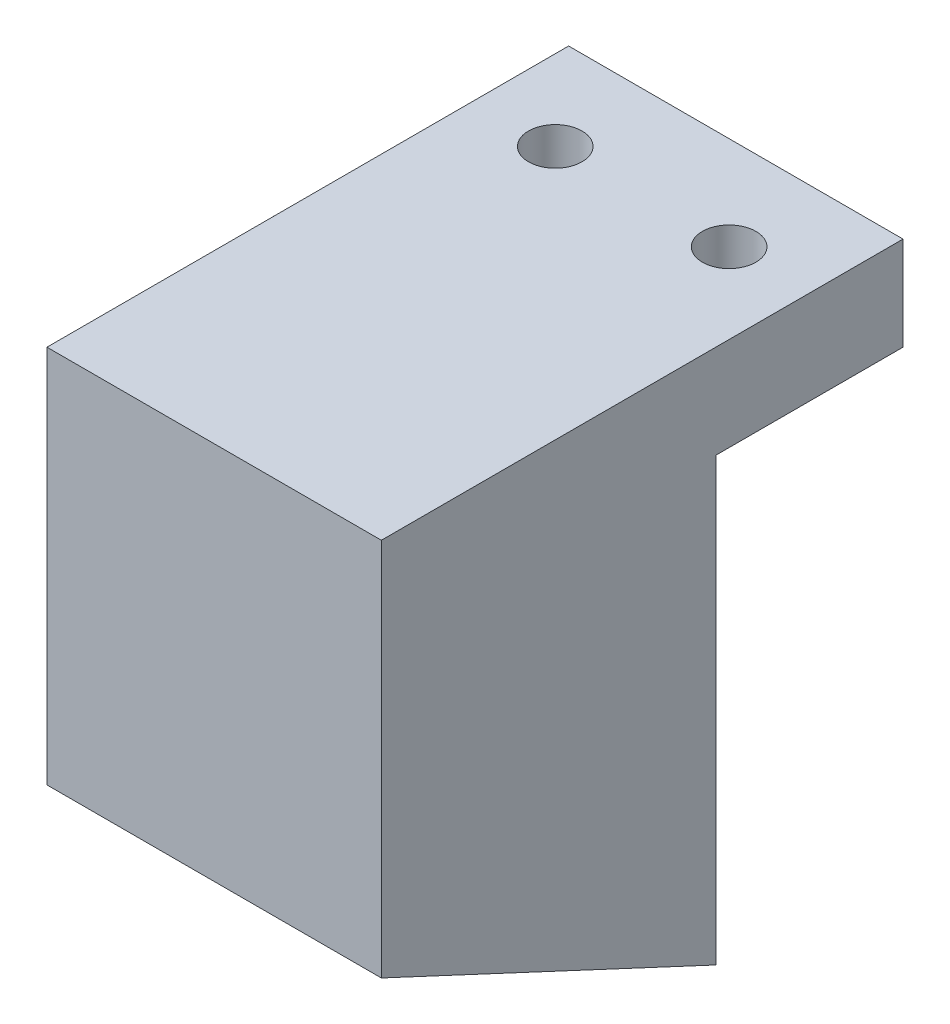
ISO-10303-21;
HEADER;
FILE_DESCRIPTION(('STEP AP214'),'2;1');
FILE_NAME('part.step','',(''),(''),'','','');
FILE_SCHEMA(('AUTOMOTIVE_DESIGN { 1 0 10303 214 1 1 1 1 }'));
ENDSEC;
DATA;
#1=APPLICATION_CONTEXT('core data for automotive mechanical design processes');
#2=APPLICATION_PROTOCOL_DEFINITION('international standard','automotive_design',2000,#1);
#3=PRODUCT_CONTEXT('',#1,'mechanical');
#4=PRODUCT('Part','Part','',(#3));
#5=PRODUCT_RELATED_PRODUCT_CATEGORY('part','',(#4));
#6=PRODUCT_DEFINITION_FORMATION('','',#4);
#7=PRODUCT_DEFINITION_CONTEXT('part definition',#1,'design');
#8=PRODUCT_DEFINITION('design','',#6,#7);
#9=PRODUCT_DEFINITION_SHAPE('','',#8);
#10=(LENGTH_UNIT() NAMED_UNIT(*) SI_UNIT(.MILLI.,.METRE.));
#11=(NAMED_UNIT(*) PLANE_ANGLE_UNIT() SI_UNIT($,.RADIAN.));
#12=(NAMED_UNIT(*) SI_UNIT($,.STERADIAN.) SOLID_ANGLE_UNIT());
#13=UNCERTAINTY_MEASURE_WITH_UNIT(LENGTH_MEASURE(1.E-05),#10,'distance_accuracy_value','');
#14=(GEOMETRIC_REPRESENTATION_CONTEXT(3) GLOBAL_UNCERTAINTY_ASSIGNED_CONTEXT((#13)) GLOBAL_UNIT_ASSIGNED_CONTEXT((#10,
#11,#12)) REPRESENTATION_CONTEXT('',''));
#15=CARTESIAN_POINT('',(0.,0.,0.));
#16=DIRECTION('',(0.,0.,1.));
#17=DIRECTION('',(1.,0.,0.));
#18=AXIS2_PLACEMENT_3D('',#15,#16,#17);
#19=CARTESIAN_POINT('',(-76.9047619047619,40.,-16.0714285714286));
#20=DIRECTION('',(0.,0.,1.));
#21=DIRECTION('',(1.,0.,0.));
#22=AXIS2_PLACEMENT_3D('',#19,#20,#21);
#23=PLANE('',#22);
#24=DIRECTION('',(-1.,0.,0.));
#25=VECTOR('',#24,1.);
#26=CARTESIAN_POINT('',(-76.9047619047619,33.,-16.0714285714286));
#27=LINE('',#26,#25);
#28=CARTESIAN_POINT('',(-51.9047619047619,33.,-16.0714285714286));
#29=VERTEX_POINT('',#28);
#30=CARTESIAN_POINT('',(-62.9124784932489,33.,-16.0714285714286));
#31=VERTEX_POINT('',#30);
#32=EDGE_CURVE('E43',#29,#31,#27,.T.);
#33=ORIENTED_EDGE('',*,*,#32,.F.);
#34=DIRECTION('',(0.,-1.,0.));
#35=VECTOR('',#34,1.);
#36=CARTESIAN_POINT('',(-51.9047619047619,40.,-16.0714285714286));
#37=LINE('',#36,#35);
#38=CARTESIAN_POINT('',(-51.9047619047619,0.,-16.0714285714286));
#39=VERTEX_POINT('',#38);
#40=EDGE_CURVE('E148',#29,#39,#37,.T.);
#41=ORIENTED_EDGE('',*,*,#40,.T.);
#42=DIRECTION('',(-1.,0.,0.));
#43=VECTOR('',#42,1.);
#44=CARTESIAN_POINT('',(-76.9047619047619,0.,-16.0714285714286));
#45=LINE('',#44,#43);
#46=CARTESIAN_POINT('',(-76.9047619047619,0.,-16.0714285714286));
#47=VERTEX_POINT('',#46);
#48=EDGE_CURVE('E101',#39,#47,#45,.T.);
#49=ORIENTED_EDGE('',*,*,#48,.T.);
#50=DIRECTION('',(0.,-1.,0.));
#51=VECTOR('',#50,1.);
#52=CARTESIAN_POINT('',(-76.9047619047619,40.,-16.0714285714286));
#53=LINE('',#52,#51);
#54=CARTESIAN_POINT('',(-76.9047619047619,33.,-16.0714285714286));
#55=VERTEX_POINT('',#54);
#56=EDGE_CURVE('E144',#55,#47,#53,.T.);
#57=ORIENTED_EDGE('',*,*,#56,.F.);
#58=CARTESIAN_POINT('',(-65.8970453162749,33.,-16.0714285714286));
#59=VERTEX_POINT('',#58);
#60=EDGE_CURVE('E11',#59,#55,#27,.T.);
#61=ORIENTED_EDGE('',*,*,#60,.F.);
#62=CARTESIAN_POINT('',(-64.4047619047619,32.6404446349412,-16.0714285714286));
#63=DIRECTION('',(0.,0.,1.));
#64=DIRECTION('',(0.,-1.,0.));
#65=AXIS2_PLACEMENT_3D('',#62,#63,#64);
#66=ELLIPSE('',#65,3.54930237472879,1.5);
#67=EDGE_CURVE('E131',#59,#31,#66,.T.);
#68=ORIENTED_EDGE('',*,*,#67,.T.);
#69=EDGE_LOOP('',(#33,#41,#49,#57,#61,#68));
#70=FACE_BOUND('',#69,.T.);
#71=ADVANCED_FACE('F33',(#70),#23,.F.);
#72=CARTESIAN_POINT('',(-76.9047619047619,40.,-16.0714285714286));
#73=DIRECTION('',(1.,0.,0.));
#74=DIRECTION('',(0.,0.,-1.));
#75=AXIS2_PLACEMENT_3D('',#72,#73,#74);
#76=PLANE('',#75);
#77=DIRECTION('',(0.,0.,1.));
#78=VECTOR('',#77,1.);
#79=CARTESIAN_POINT('',(-76.9047619047619,40.,-16.0714285714286));
#80=LINE('',#79,#78);
#81=CARTESIAN_POINT('',(-76.9047619047619,40.,-30.0714285714286));
#82=VERTEX_POINT('',#81);
#83=CARTESIAN_POINT('',(-76.9047619047619,40.,8.92857142857143));
#84=VERTEX_POINT('',#83);
#85=EDGE_CURVE('E92',#82,#84,#80,.T.);
#86=ORIENTED_EDGE('',*,*,#85,.F.);
#87=DIRECTION('',(0.,1.,0.));
#88=VECTOR('',#87,1.);
#89=CARTESIAN_POINT('',(-76.9047619047619,40.,-30.0714285714286));
#90=LINE('',#89,#88);
#91=CARTESIAN_POINT('',(-76.9047619047619,33.,-30.0714285714286));
#92=VERTEX_POINT('',#91);
#93=EDGE_CURVE('E96',#92,#82,#90,.T.);
#94=ORIENTED_EDGE('',*,*,#93,.F.);
#95=DIRECTION('',(0.,0.,1.));
#96=VECTOR('',#95,1.);
#97=CARTESIAN_POINT('',(-76.9047619047619,33.,-30.0714285714286));
#98=LINE('',#97,#96);
#99=EDGE_CURVE('E122',#92,#55,#98,.T.);
#100=ORIENTED_EDGE('',*,*,#99,.T.);
#101=ORIENTED_EDGE('',*,*,#56,.T.);
#102=DIRECTION('',(0.,0.422618261740694,0.906307787036653));
#103=VECTOR('',#102,1.);
#104=CARTESIAN_POINT('',(-76.9047619047619,7.14424780626901,-0.750539709049177));
#105=LINE('',#104,#103);
#106=CARTESIAN_POINT('',(-76.9047619047619,11.6576914538748,8.92857142857143));
#107=VERTEX_POINT('',#106);
#108=EDGE_CURVE('E140',#47,#107,#105,.T.);
#109=ORIENTED_EDGE('',*,*,#108,.T.);
#110=DIRECTION('',(0.,-1.,0.));
#111=VECTOR('',#110,1.);
#112=CARTESIAN_POINT('',(-76.9047619047619,40.,8.92857142857143));
#113=LINE('',#112,#111);
#114=EDGE_CURVE('E37',#84,#107,#113,.T.);
#115=ORIENTED_EDGE('',*,*,#114,.F.);
#116=EDGE_LOOP('',(#86,#94,#100,#101,#109,#115));
#117=FACE_BOUND('',#116,.T.);
#118=ADVANCED_FACE('F35',(#117),#76,.F.);
#119=CARTESIAN_POINT('',(-76.9047619047619,40.,8.92857142857143));
#120=DIRECTION('',(0.,0.,-1.));
#121=DIRECTION('',(-1.,0.,0.));
#122=AXIS2_PLACEMENT_3D('',#119,#120,#121);
#123=PLANE('',#122);
#124=ORIENTED_EDGE('',*,*,#114,.T.);
#125=DIRECTION('',(1.,0.,0.));
#126=VECTOR('',#125,1.);
#127=CARTESIAN_POINT('',(-91.9047619047619,11.6576914538748,8.92857142857143));
#128=LINE('',#127,#126);
#129=CARTESIAN_POINT('',(-51.9047619047619,11.6576914538748,8.92857142857143));
#130=VERTEX_POINT('',#129);
#131=EDGE_CURVE('E137',#107,#130,#128,.T.);
#132=ORIENTED_EDGE('',*,*,#131,.T.);
#133=DIRECTION('',(0.,-1.,0.));
#134=VECTOR('',#133,1.);
#135=CARTESIAN_POINT('',(-51.9047619047619,40.,8.92857142857143));
#136=LINE('',#135,#134);
#137=CARTESIAN_POINT('',(-51.9047619047619,40.,8.92857142857143));
#138=VERTEX_POINT('',#137);
#139=EDGE_CURVE('E149',#138,#130,#136,.T.);
#140=ORIENTED_EDGE('',*,*,#139,.F.);
#141=DIRECTION('',(1.,0.,0.));
#142=VECTOR('',#141,1.);
#143=CARTESIAN_POINT('',(-76.9047619047619,40.,8.92857142857143));
#144=LINE('',#143,#142);
#145=EDGE_CURVE('E100',#84,#138,#144,.T.);
#146=ORIENTED_EDGE('',*,*,#145,.F.);
#147=EDGE_LOOP('',(#124,#132,#140,#146));
#148=FACE_BOUND('',#147,.T.);
#149=ADVANCED_FACE('F155',(#148),#123,.F.);
#150=CARTESIAN_POINT('',(-51.9047619047619,40.,-16.0714285714286));
#151=DIRECTION('',(-1.,0.,0.));
#152=DIRECTION('',(0.,0.,1.));
#153=AXIS2_PLACEMENT_3D('',#150,#151,#152);
#154=PLANE('',#153);
#155=ORIENTED_EDGE('',*,*,#139,.T.);
#156=DIRECTION('',(0.,0.422618261740693,0.906307787036653));
#157=VECTOR('',#156,1.);
#158=CARTESIAN_POINT('',(-51.9047619047619,11.6576914538748,8.92857142857143));
#159=LINE('',#158,#157);
#160=EDGE_CURVE('E135',#39,#130,#159,.T.);
#161=ORIENTED_EDGE('',*,*,#160,.F.);
#162=ORIENTED_EDGE('',*,*,#40,.F.);
#163=DIRECTION('',(0.,0.,1.));
#164=VECTOR('',#163,1.);
#165=CARTESIAN_POINT('',(-51.9047619047619,33.,-30.0714285714286));
#166=LINE('',#165,#164);
#167=CARTESIAN_POINT('',(-51.9047619047619,33.,-30.0714285714286));
#168=VERTEX_POINT('',#167);
#169=EDGE_CURVE('E125',#168,#29,#166,.T.);
#170=ORIENTED_EDGE('',*,*,#169,.F.);
#171=DIRECTION('',(0.,-1.,0.));
#172=VECTOR('',#171,1.);
#173=CARTESIAN_POINT('',(-51.9047619047619,40.,-30.0714285714286));
#174=LINE('',#173,#172);
#175=CARTESIAN_POINT('',(-51.9047619047619,40.,-30.0714285714286));
#176=VERTEX_POINT('',#175);
#177=EDGE_CURVE('E110',#176,#168,#174,.T.);
#178=ORIENTED_EDGE('',*,*,#177,.F.);
#179=DIRECTION('',(0.,0.,-1.));
#180=VECTOR('',#179,1.);
#181=CARTESIAN_POINT('',(-51.9047619047619,40.,-16.0714285714286));
#182=LINE('',#181,#180);
#183=EDGE_CURVE('E107',#138,#176,#182,.T.);
#184=ORIENTED_EDGE('',*,*,#183,.F.);
#185=EDGE_LOOP('',(#155,#161,#162,#170,#178,#184));
#186=FACE_BOUND('',#185,.T.);
#187=ADVANCED_FACE('F156',(#186),#154,.F.);
#188=CARTESIAN_POINT('',(0.,40.,0.));
#189=DIRECTION('',(0.,1.,0.));
#190=DIRECTION('',(0.,0.,1.));
#191=AXIS2_PLACEMENT_3D('',#188,#189,#190);
#192=PLANE('',#191);
#193=CARTESIAN_POINT('',(-70.9047619047619,40.,-23.0714285714286));
#194=DIRECTION('',(0.,1.,0.));
#195=DIRECTION('',(0.,0.,1.));
#196=AXIS2_PLACEMENT_3D('',#193,#194,#195);
#197=CIRCLE('',#196,2.);
#198=CARTESIAN_POINT('',(-70.9047619047619,40.,-21.0714285714286));
#199=VERTEX_POINT('',#198);
#200=EDGE_CURVE('E118',#199,#199,#197,.T.);
#201=ORIENTED_EDGE('',*,*,#200,.F.);
#202=EDGE_LOOP('',(#201));
#203=FACE_BOUND('',#202,.T.);
#204=CARTESIAN_POINT('',(-57.9047619047619,40.,-23.0714285714286));
#205=DIRECTION('',(0.,1.,0.));
#206=DIRECTION('',(0.,0.,1.));
#207=AXIS2_PLACEMENT_3D('',#204,#205,#206);
#208=CIRCLE('',#207,2.);
#209=CARTESIAN_POINT('',(-57.9047619047619,40.,-21.0714285714286));
#210=VERTEX_POINT('',#209);
#211=EDGE_CURVE('E283',#210,#210,#208,.T.);
#212=ORIENTED_EDGE('',*,*,#211,.F.);
#213=EDGE_LOOP('',(#212));
#214=FACE_BOUND('',#213,.T.);
#215=ORIENTED_EDGE('',*,*,#85,.T.);
#216=ORIENTED_EDGE('',*,*,#145,.T.);
#217=ORIENTED_EDGE('',*,*,#183,.T.);
#218=DIRECTION('',(1.,0.,0.));
#219=VECTOR('',#218,1.);
#220=CARTESIAN_POINT('',(-76.9047619047619,40.,-30.0714285714286));
#221=LINE('',#220,#219);
#222=EDGE_CURVE('E104',#82,#176,#221,.T.);
#223=ORIENTED_EDGE('',*,*,#222,.F.);
#224=EDGE_LOOP('',(#215,#216,#217,#223));
#225=FACE_BOUND('',#224,.T.);
#226=ADVANCED_FACE('F105',(#203,#214,#225),#192,.T.);
#227=CARTESIAN_POINT('',(-91.9047619047619,11.6576914538748,8.92857142857143));
#228=DIRECTION('',(0.,0.906307787036653,-0.422618261740693));
#229=DIRECTION('',(0.,0.422618261740694,0.906307787036653));
#230=AXIS2_PLACEMENT_3D('',#227,#228,#229);
#231=PLANE('',#230);
#232=CARTESIAN_POINT('',(-64.4047619047619,5.8297856244706,-3.56941295466401));
#233=DIRECTION('',(0.,-0.906307787036653,0.422618261740693));
#234=DIRECTION('',(0.,-0.422618261740693,-0.906307787036653));
#235=AXIS2_PLACEMENT_3D('',#232,#233,#234);
#236=CIRCLE('',#235,1.5);
#237=CARTESIAN_POINT('',(-64.4047619047619,5.19585823185957,-4.92887463521898));
#238=VERTEX_POINT('',#237);
#239=EDGE_CURVE('E128',#238,#238,#236,.T.);
#240=ORIENTED_EDGE('',*,*,#239,.F.);
#241=EDGE_LOOP('',(#240));
#242=FACE_BOUND('',#241,.T.);
#243=ORIENTED_EDGE('',*,*,#48,.F.);
#244=ORIENTED_EDGE('',*,*,#160,.T.);
#245=ORIENTED_EDGE('',*,*,#131,.F.);
#246=ORIENTED_EDGE('',*,*,#108,.F.);
#247=EDGE_LOOP('',(#243,#244,#245,#246));
#248=FACE_BOUND('',#247,.T.);
#249=ADVANCED_FACE('F164',(#242,#248),#231,.F.);
#250=CARTESIAN_POINT('',(-64.4047619047619,38.4568659577901,-18.783670377329));
#251=DIRECTION('',(0.,-0.906307787036653,0.422618261740693));
#252=DIRECTION('',(0.,-0.422618261740693,-0.906307787036653));
#253=AXIS2_PLACEMENT_3D('',#250,#251,#252);
#254=CYLINDRICAL_SURFACE('',#253,1.5);
#255=ORIENTED_EDGE('',*,*,#239,.T.);
#256=EDGE_LOOP('',(#255));
#257=FACE_BOUND('',#256,.T.);
#258=EDGE_CURVE('E132',#31,#59,#66,.T.);
#259=ORIENTED_EDGE('',*,*,#258,.F.);
#260=ORIENTED_EDGE('',*,*,#67,.F.);
#261=EDGE_LOOP('',(#259,#260));
#262=FACE_BOUND('',#261,.T.);
#263=ADVANCED_FACE('F185',(#257,#262),#254,.F.);
#264=CARTESIAN_POINT('',(-76.9047619047619,33.,-30.0714285714286));
#265=DIRECTION('',(0.,1.,0.));
#266=DIRECTION('',(0.,0.,1.));
#267=AXIS2_PLACEMENT_3D('',#264,#265,#266);
#268=PLANE('',#267);
#269=CARTESIAN_POINT('',(-70.9047619047619,33.,-23.0714285714286));
#270=DIRECTION('',(0.,-1.,0.));
#271=DIRECTION('',(0.,0.,-1.));
#272=AXIS2_PLACEMENT_3D('',#269,#270,#271);
#273=CIRCLE('',#272,2.);
#274=CARTESIAN_POINT('',(-70.9047619047619,33.,-25.0714285714286));
#275=VERTEX_POINT('',#274);
#276=EDGE_CURVE('E282',#275,#275,#273,.T.);
#277=ORIENTED_EDGE('',*,*,#276,.F.);
#278=EDGE_LOOP('',(#277));
#279=FACE_BOUND('',#278,.T.);
#280=CARTESIAN_POINT('',(-57.9047619047619,33.,-23.0714285714286));
#281=DIRECTION('',(0.,-1.,0.));
#282=DIRECTION('',(0.,0.,-1.));
#283=AXIS2_PLACEMENT_3D('',#280,#281,#282);
#284=CIRCLE('',#283,2.);
#285=CARTESIAN_POINT('',(-57.9047619047619,33.,-25.0714285714286));
#286=VERTEX_POINT('',#285);
#287=EDGE_CURVE('E284',#286,#286,#284,.T.);
#288=ORIENTED_EDGE('',*,*,#287,.F.);
#289=EDGE_LOOP('',(#288));
#290=FACE_BOUND('',#289,.T.);
#291=ORIENTED_EDGE('',*,*,#32,.T.);
#292=EDGE_CURVE('E44',#31,#59,#27,.T.);
#293=ORIENTED_EDGE('',*,*,#292,.T.);
#294=ORIENTED_EDGE('',*,*,#60,.T.);
#295=ORIENTED_EDGE('',*,*,#99,.F.);
#296=DIRECTION('',(-1.,0.,0.));
#297=VECTOR('',#296,1.);
#298=CARTESIAN_POINT('',(-76.9047619047619,33.,-30.0714285714286));
#299=LINE('',#298,#297);
#300=EDGE_CURVE('E114',#168,#92,#299,.T.);
#301=ORIENTED_EDGE('',*,*,#300,.F.);
#302=ORIENTED_EDGE('',*,*,#169,.T.);
#303=EDGE_LOOP('',(#291,#293,#294,#295,#301,#302));
#304=FACE_BOUND('',#303,.T.);
#305=ADVANCED_FACE('F159',(#279,#290,#304),#268,.F.);
#306=CARTESIAN_POINT('',(0.,0.,-30.0714285714286));
#307=DIRECTION('',(0.,0.,1.));
#308=DIRECTION('',(1.,0.,0.));
#309=AXIS2_PLACEMENT_3D('',#306,#307,#308);
#310=PLANE('',#309);
#311=ORIENTED_EDGE('',*,*,#93,.T.);
#312=ORIENTED_EDGE('',*,*,#222,.T.);
#313=ORIENTED_EDGE('',*,*,#177,.T.);
#314=ORIENTED_EDGE('',*,*,#300,.T.);
#315=EDGE_LOOP('',(#311,#312,#313,#314));
#316=FACE_BOUND('',#315,.T.);
#317=ADVANCED_FACE('F112',(#316),#310,.F.);
#318=CARTESIAN_POINT('',(0.,0.,-16.0714285714286));
#319=DIRECTION('',(0.,0.,1.));
#320=DIRECTION('',(1.,0.,0.));
#321=AXIS2_PLACEMENT_3D('',#318,#319,#320);
#322=PLANE('',#321);
#323=ORIENTED_EDGE('',*,*,#292,.F.);
#324=ORIENTED_EDGE('',*,*,#258,.T.);
#325=EDGE_LOOP('',(#323,#324));
#326=FACE_BOUND('',#325,.T.);
#327=ADVANCED_FACE('F227',(#326),#322,.T.);
#328=CARTESIAN_POINT('',(-57.9047619047619,47.,-23.0714285714286));
#329=DIRECTION('',(0.,-1.,0.));
#330=DIRECTION('',(0.,0.,-1.));
#331=AXIS2_PLACEMENT_3D('',#328,#329,#330);
#332=CYLINDRICAL_SURFACE('',#331,2.);
#333=ORIENTED_EDGE('',*,*,#211,.T.);
#334=EDGE_LOOP('',(#333));
#335=FACE_BOUND('',#334,.T.);
#336=ORIENTED_EDGE('',*,*,#287,.T.);
#337=EDGE_LOOP('',(#336));
#338=FACE_BOUND('',#337,.T.);
#339=ADVANCED_FACE('F233',(#335,#338),#332,.F.);
#340=CARTESIAN_POINT('',(-70.9047619047619,47.,-23.0714285714286));
#341=DIRECTION('',(0.,-1.,0.));
#342=DIRECTION('',(0.,0.,-1.));
#343=AXIS2_PLACEMENT_3D('',#340,#341,#342);
#344=CYLINDRICAL_SURFACE('',#343,2.);
#345=ORIENTED_EDGE('',*,*,#200,.T.);
#346=EDGE_LOOP('',(#345));
#347=FACE_BOUND('',#346,.T.);
#348=ORIENTED_EDGE('',*,*,#276,.T.);
#349=EDGE_LOOP('',(#348));
#350=FACE_BOUND('',#349,.T.);
#351=ADVANCED_FACE('F240',(#347,#350),#344,.F.);
#352=CLOSED_SHELL('',(#71,#118,#149,#187,#226,#249,#263,#305,#317,#327,#339,#351));
#353=MANIFOLD_SOLID_BREP('B2',#352);
#354=ADVANCED_BREP_SHAPE_REPRESENTATION('',(#18,#353),#14);
#355=SHAPE_DEFINITION_REPRESENTATION(#9,#354);
ENDSEC;
END-ISO-10303-21;
